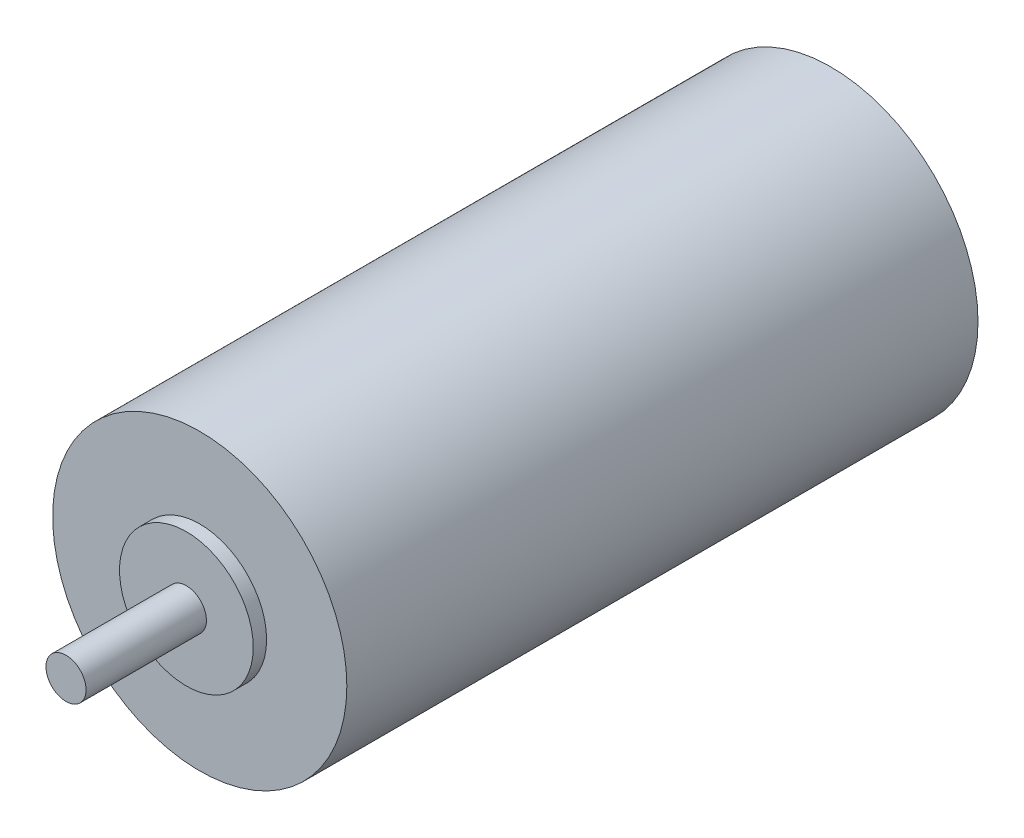
ISO-10303-21;
HEADER;
FILE_DESCRIPTION(('STEP AP214'),'2;1');
FILE_NAME('part.step','',(''),(''),'','','');
FILE_SCHEMA(('AUTOMOTIVE_DESIGN { 1 0 10303 214 1 1 1 1 }'));
ENDSEC;
DATA;
#1=APPLICATION_CONTEXT('core data for automotive mechanical design processes');
#2=APPLICATION_PROTOCOL_DEFINITION('international standard','automotive_design',2000,#1);
#3=PRODUCT_CONTEXT('',#1,'mechanical');
#4=PRODUCT('Part','Part','',(#3));
#5=PRODUCT_RELATED_PRODUCT_CATEGORY('part','',(#4));
#6=PRODUCT_DEFINITION_FORMATION('','',#4);
#7=PRODUCT_DEFINITION_CONTEXT('part definition',#1,'design');
#8=PRODUCT_DEFINITION('design','',#6,#7);
#9=PRODUCT_DEFINITION_SHAPE('','',#8);
#10=(LENGTH_UNIT() NAMED_UNIT(*) SI_UNIT(.MILLI.,.METRE.));
#11=(NAMED_UNIT(*) PLANE_ANGLE_UNIT() SI_UNIT($,.RADIAN.));
#12=(NAMED_UNIT(*) SI_UNIT($,.STERADIAN.) SOLID_ANGLE_UNIT());
#13=UNCERTAINTY_MEASURE_WITH_UNIT(LENGTH_MEASURE(1.E-05),#10,'distance_accuracy_value','');
#14=(GEOMETRIC_REPRESENTATION_CONTEXT(3) GLOBAL_UNCERTAINTY_ASSIGNED_CONTEXT((#13)) GLOBAL_UNIT_ASSIGNED_CONTEXT((#10,
#11,#12)) REPRESENTATION_CONTEXT('',''));
#15=CARTESIAN_POINT('',(0.,0.,0.));
#16=DIRECTION('',(0.,0.,1.));
#17=DIRECTION('',(1.,0.,0.));
#18=AXIS2_PLACEMENT_3D('',#15,#16,#17);
#19=CARTESIAN_POINT('',(0.,0.,47.2));
#20=DIRECTION('',(0.,0.,-1.));
#21=DIRECTION('',(-1.,0.,0.));
#22=AXIS2_PLACEMENT_3D('',#19,#20,#21);
#23=CYLINDRICAL_SURFACE('',#22,11.);
#24=CARTESIAN_POINT('',(0.,0.,47.2));
#25=DIRECTION('',(0.,0.,1.));
#26=DIRECTION('',(1.,0.,0.));
#27=AXIS2_PLACEMENT_3D('',#24,#25,#26);
#28=CIRCLE('',#27,11.);
#29=CARTESIAN_POINT('',(11.,0.,47.2));
#30=VERTEX_POINT('',#29);
#31=EDGE_CURVE('E61',#30,#30,#28,.T.);
#32=ORIENTED_EDGE('',*,*,#31,.F.);
#33=EDGE_LOOP('',(#32));
#34=FACE_BOUND('',#33,.T.);
#35=CARTESIAN_POINT('',(0.,0.,0.));
#36=DIRECTION('',(0.,0.,1.));
#37=DIRECTION('',(1.,0.,0.));
#38=AXIS2_PLACEMENT_3D('',#35,#36,#37);
#39=CIRCLE('',#38,11.);
#40=CARTESIAN_POINT('',(11.,0.,0.));
#41=VERTEX_POINT('',#40);
#42=EDGE_CURVE('E34',#41,#41,#39,.T.);
#43=ORIENTED_EDGE('',*,*,#42,.T.);
#44=EDGE_LOOP('',(#43));
#45=FACE_BOUND('',#44,.T.);
#46=ADVANCED_FACE('F31',(#34,#45),#23,.T.);
#47=CARTESIAN_POINT('',(0.,0.,47.2));
#48=DIRECTION('',(0.,0.,1.));
#49=DIRECTION('',(1.,0.,0.));
#50=AXIS2_PLACEMENT_3D('',#47,#48,#49);
#51=PLANE('',#50);
#52=CARTESIAN_POINT('',(0.,0.,47.2));
#53=DIRECTION('',(0.,0.,1.));
#54=DIRECTION('',(1.,0.,0.));
#55=AXIS2_PLACEMENT_3D('',#52,#53,#54);
#56=CIRCLE('',#55,5.);
#57=CARTESIAN_POINT('',(5.,0.,47.2));
#58=VERTEX_POINT('',#57);
#59=EDGE_CURVE('E43',#58,#58,#56,.T.);
#60=ORIENTED_EDGE('',*,*,#59,.F.);
#61=EDGE_LOOP('',(#60));
#62=FACE_BOUND('',#61,.T.);
#63=ORIENTED_EDGE('',*,*,#31,.T.);
#64=EDGE_LOOP('',(#63));
#65=FACE_BOUND('',#64,.T.);
#66=ADVANCED_FACE('F72',(#62,#65),#51,.T.);
#67=CARTESIAN_POINT('',(0.,0.,0.));
#68=DIRECTION('',(0.,0.,1.));
#69=DIRECTION('',(1.,0.,0.));
#70=AXIS2_PLACEMENT_3D('',#67,#68,#69);
#71=PLANE('',#70);
#72=CARTESIAN_POINT('',(0.,0.,0.));
#73=DIRECTION('',(0.,0.,1.));
#74=DIRECTION('',(1.,0.,0.));
#75=AXIS2_PLACEMENT_3D('',#72,#73,#74);
#76=CIRCLE('',#75,3.);
#77=CARTESIAN_POINT('',(3.,0.,0.));
#78=VERTEX_POINT('',#77);
#79=EDGE_CURVE('E54',#78,#78,#76,.T.);
#80=ORIENTED_EDGE('',*,*,#79,.T.);
#81=EDGE_LOOP('',(#80));
#82=FACE_BOUND('',#81,.T.);
#83=ORIENTED_EDGE('',*,*,#42,.F.);
#84=EDGE_LOOP('',(#83));
#85=FACE_BOUND('',#84,.T.);
#86=ADVANCED_FACE('F69',(#82,#85),#71,.F.);
#87=CARTESIAN_POINT('',(0.,0.,47.2));
#88=DIRECTION('',(0.,0.,1.));
#89=DIRECTION('',(1.,0.,0.));
#90=AXIS2_PLACEMENT_3D('',#87,#88,#89);
#91=CYLINDRICAL_SURFACE('',#90,5.);
#92=CARTESIAN_POINT('',(0.,0.,48.2));
#93=DIRECTION('',(0.,0.,1.));
#94=DIRECTION('',(1.,0.,0.));
#95=AXIS2_PLACEMENT_3D('',#92,#93,#94);
#96=CIRCLE('',#95,5.);
#97=CARTESIAN_POINT('',(5.,0.,48.2));
#98=VERTEX_POINT('',#97);
#99=EDGE_CURVE('E57',#98,#98,#96,.T.);
#100=ORIENTED_EDGE('',*,*,#99,.F.);
#101=EDGE_LOOP('',(#100));
#102=FACE_BOUND('',#101,.T.);
#103=ORIENTED_EDGE('',*,*,#59,.T.);
#104=EDGE_LOOP('',(#103));
#105=FACE_BOUND('',#104,.T.);
#106=ADVANCED_FACE('F71',(#102,#105),#91,.T.);
#107=CARTESIAN_POINT('',(0.,0.,48.2));
#108=DIRECTION('',(0.,0.,-1.));
#109=DIRECTION('',(-1.,0.,0.));
#110=AXIS2_PLACEMENT_3D('',#107,#108,#109);
#111=PLANE('',#110);
#112=CARTESIAN_POINT('',(0.,0.,48.2));
#113=DIRECTION('',(0.,0.,1.));
#114=DIRECTION('',(1.,0.,0.));
#115=AXIS2_PLACEMENT_3D('',#112,#113,#114);
#116=CIRCLE('',#115,1.5);
#117=CARTESIAN_POINT('',(1.5,0.,48.2));
#118=VERTEX_POINT('',#117);
#119=EDGE_CURVE('E38',#118,#118,#116,.T.);
#120=ORIENTED_EDGE('',*,*,#119,.F.);
#121=EDGE_LOOP('',(#120));
#122=FACE_BOUND('',#121,.T.);
#123=ORIENTED_EDGE('',*,*,#99,.T.);
#124=EDGE_LOOP('',(#123));
#125=FACE_BOUND('',#124,.T.);
#126=ADVANCED_FACE('F78',(#122,#125),#111,.F.);
#127=CARTESIAN_POINT('',(0.,0.,47.2));
#128=DIRECTION('',(0.,0.,1.));
#129=DIRECTION('',(1.,0.,0.));
#130=AXIS2_PLACEMENT_3D('',#127,#128,#129);
#131=CYLINDRICAL_SURFACE('',#130,3.);
#132=ORIENTED_EDGE('',*,*,#79,.F.);
#133=EDGE_LOOP('',(#132));
#134=FACE_BOUND('',#133,.T.);
#135=CARTESIAN_POINT('',(0.,0.,-2.3));
#136=DIRECTION('',(0.,0.,1.));
#137=DIRECTION('',(1.,0.,0.));
#138=AXIS2_PLACEMENT_3D('',#135,#136,#137);
#139=CIRCLE('',#138,3.);
#140=CARTESIAN_POINT('',(3.,0.,-2.3));
#141=VERTEX_POINT('',#140);
#142=EDGE_CURVE('E50',#141,#141,#139,.T.);
#143=ORIENTED_EDGE('',*,*,#142,.T.);
#144=EDGE_LOOP('',(#143));
#145=FACE_BOUND('',#144,.T.);
#146=ADVANCED_FACE('F108',(#134,#145),#131,.T.);
#147=CARTESIAN_POINT('',(0.,0.,-2.3));
#148=DIRECTION('',(0.,0.,1.));
#149=DIRECTION('',(1.,0.,0.));
#150=AXIS2_PLACEMENT_3D('',#147,#148,#149);
#151=PLANE('',#150);
#152=CARTESIAN_POINT('',(0.,0.,-2.3));
#153=DIRECTION('',(0.,0.,-1.));
#154=DIRECTION('',(-1.,0.,0.));
#155=AXIS2_PLACEMENT_3D('',#152,#153,#154);
#156=CIRCLE('',#155,1.);
#157=CARTESIAN_POINT('',(-1.,0.,-2.3));
#158=VERTEX_POINT('',#157);
#159=EDGE_CURVE('E10',#158,#158,#156,.T.);
#160=ORIENTED_EDGE('',*,*,#159,.F.);
#161=EDGE_LOOP('',(#160));
#162=FACE_BOUND('',#161,.T.);
#163=ORIENTED_EDGE('',*,*,#142,.F.);
#164=EDGE_LOOP('',(#163));
#165=FACE_BOUND('',#164,.T.);
#166=ADVANCED_FACE('F113',(#162,#165),#151,.F.);
#167=CARTESIAN_POINT('',(0.,0.,57.2));
#168=DIRECTION('',(0.,0.,-1.));
#169=DIRECTION('',(-1.,0.,0.));
#170=AXIS2_PLACEMENT_3D('',#167,#168,#169);
#171=CYLINDRICAL_SURFACE('',#170,1.5);
#172=CARTESIAN_POINT('',(0.,0.,57.2));
#173=DIRECTION('',(0.,0.,1.));
#174=DIRECTION('',(1.,0.,0.));
#175=AXIS2_PLACEMENT_3D('',#172,#173,#174);
#176=CIRCLE('',#175,1.5);
#177=CARTESIAN_POINT('',(1.5,0.,57.2));
#178=VERTEX_POINT('',#177);
#179=EDGE_CURVE('E48',#178,#178,#176,.T.);
#180=ORIENTED_EDGE('',*,*,#179,.F.);
#181=EDGE_LOOP('',(#180));
#182=FACE_BOUND('',#181,.T.);
#183=ORIENTED_EDGE('',*,*,#119,.T.);
#184=EDGE_LOOP('',(#183));
#185=FACE_BOUND('',#184,.T.);
#186=ADVANCED_FACE('F128',(#182,#185),#171,.T.);
#187=CARTESIAN_POINT('',(0.,0.,57.2));
#188=DIRECTION('',(0.,0.,1.));
#189=DIRECTION('',(1.,0.,0.));
#190=AXIS2_PLACEMENT_3D('',#187,#188,#189);
#191=PLANE('',#190);
#192=ORIENTED_EDGE('',*,*,#179,.T.);
#193=EDGE_LOOP('',(#192));
#194=FACE_BOUND('',#193,.T.);
#195=ADVANCED_FACE('F133',(#194),#191,.T.);
#196=CARTESIAN_POINT('',(0.,0.,-4.95));
#197=DIRECTION('',(0.,0.,1.));
#198=DIRECTION('',(1.,0.,0.));
#199=AXIS2_PLACEMENT_3D('',#196,#197,#198);
#200=CYLINDRICAL_SURFACE('',#199,1.);
#201=CARTESIAN_POINT('',(0.,0.,-4.95));
#202=DIRECTION('',(0.,0.,-1.));
#203=DIRECTION('',(-1.,0.,0.));
#204=AXIS2_PLACEMENT_3D('',#201,#202,#203);
#205=CIRCLE('',#204,1.);
#206=CARTESIAN_POINT('',(-1.,0.,-4.95));
#207=VERTEX_POINT('',#206);
#208=EDGE_CURVE('E47',#207,#207,#205,.T.);
#209=ORIENTED_EDGE('',*,*,#208,.F.);
#210=EDGE_LOOP('',(#209));
#211=FACE_BOUND('',#210,.T.);
#212=ORIENTED_EDGE('',*,*,#159,.T.);
#213=EDGE_LOOP('',(#212));
#214=FACE_BOUND('',#213,.T.);
#215=ADVANCED_FACE('F143',(#211,#214),#200,.T.);
#216=CARTESIAN_POINT('',(0.,0.,-4.95));
#217=DIRECTION('',(0.,0.,-1.));
#218=DIRECTION('',(-1.,0.,0.));
#219=AXIS2_PLACEMENT_3D('',#216,#217,#218);
#220=PLANE('',#219);
#221=ORIENTED_EDGE('',*,*,#208,.T.);
#222=EDGE_LOOP('',(#221));
#223=FACE_BOUND('',#222,.T.);
#224=ADVANCED_FACE('F160',(#223),#220,.T.);
#225=CLOSED_SHELL('',(#46,#66,#86,#106,#126,#146,#166,#186,#195,#215,#224));
#226=MANIFOLD_SOLID_BREP('B2',#225);
#227=ADVANCED_BREP_SHAPE_REPRESENTATION('',(#18,#226),#14);
#228=SHAPE_DEFINITION_REPRESENTATION(#9,#227);
ENDSEC;
END-ISO-10303-21;
